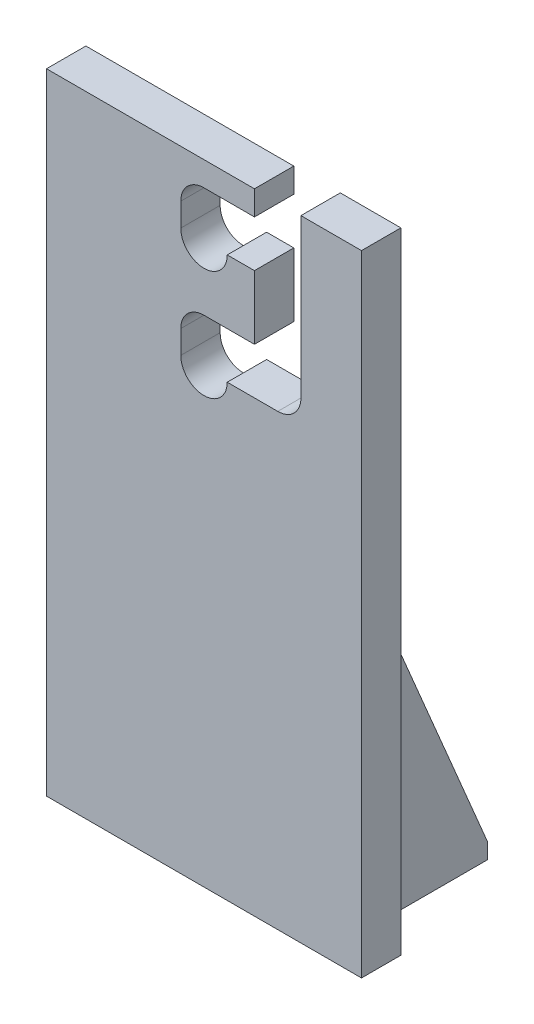
ISO-10303-21;
HEADER;
FILE_DESCRIPTION(('STEP AP214'),'2;1');
FILE_NAME('part.step','',(''),(''),'','','');
FILE_SCHEMA(('AUTOMOTIVE_DESIGN { 1 0 10303 214 1 1 1 1 }'));
ENDSEC;
DATA;
#1=APPLICATION_CONTEXT('core data for automotive mechanical design processes');
#2=APPLICATION_PROTOCOL_DEFINITION('international standard','automotive_design',2000,#1);
#3=PRODUCT_CONTEXT('',#1,'mechanical');
#4=PRODUCT('Part','Part','',(#3));
#5=PRODUCT_RELATED_PRODUCT_CATEGORY('part','',(#4));
#6=PRODUCT_DEFINITION_FORMATION('','',#4);
#7=PRODUCT_DEFINITION_CONTEXT('part definition',#1,'design');
#8=PRODUCT_DEFINITION('design','',#6,#7);
#9=PRODUCT_DEFINITION_SHAPE('','',#8);
#10=(LENGTH_UNIT() NAMED_UNIT(*) SI_UNIT(.MILLI.,.METRE.));
#11=(NAMED_UNIT(*) PLANE_ANGLE_UNIT() SI_UNIT($,.RADIAN.));
#12=(NAMED_UNIT(*) SI_UNIT($,.STERADIAN.) SOLID_ANGLE_UNIT());
#13=UNCERTAINTY_MEASURE_WITH_UNIT(LENGTH_MEASURE(1.E-05),#10,'distance_accuracy_value','');
#14=(GEOMETRIC_REPRESENTATION_CONTEXT(3) GLOBAL_UNCERTAINTY_ASSIGNED_CONTEXT((#13)) GLOBAL_UNIT_ASSIGNED_CONTEXT((#10,
#11,#12)) REPRESENTATION_CONTEXT('',''));
#15=CARTESIAN_POINT('',(0.,0.,0.));
#16=DIRECTION('',(0.,0.,1.));
#17=DIRECTION('',(1.,0.,0.));
#18=AXIS2_PLACEMENT_3D('',#15,#16,#17);
#19=CARTESIAN_POINT('',(0.,0.,2.5));
#20=DIRECTION('',(0.,0.,1.));
#21=DIRECTION('',(1.,0.,0.));
#22=AXIS2_PLACEMENT_3D('',#19,#20,#21);
#23=PLANE('',#22);
#24=CARTESIAN_POINT('',(10.,35.5,2.5));
#25=DIRECTION('',(0.,0.,-1.));
#26=DIRECTION('',(-1.,0.,0.));
#27=AXIS2_PLACEMENT_3D('',#24,#25,#26);
#28=CIRCLE('',#27,1.475);
#29=CARTESIAN_POINT('',(11.475,35.5,2.5));
#30=VERTEX_POINT('',#29);
#31=CARTESIAN_POINT('',(8.525,35.5,2.5));
#32=VERTEX_POINT('',#31);
#33=EDGE_CURVE('E230',#30,#32,#28,.T.);
#34=ORIENTED_EDGE('',*,*,#33,.T.);
#35=DIRECTION('',(0.,1.,0.));
#36=VECTOR('',#35,1.);
#37=CARTESIAN_POINT('',(8.525,35.5,2.5));
#38=LINE('',#37,#36);
#39=CARTESIAN_POINT('',(8.525,36.98,2.5));
#40=VERTEX_POINT('',#39);
#41=EDGE_CURVE('E274',#32,#40,#38,.T.);
#42=ORIENTED_EDGE('',*,*,#41,.T.);
#43=CARTESIAN_POINT('',(9.995,36.98,2.5));
#44=DIRECTION('',(0.,0.,1.));
#45=DIRECTION('',(1.,0.,0.));
#46=AXIS2_PLACEMENT_3D('',#43,#44,#45);
#47=CIRCLE('',#46,1.47);
#48=CARTESIAN_POINT('',(9.995,38.45,2.5));
#49=VERTEX_POINT('',#48);
#50=EDGE_CURVE('E332',#40,#49,#47,.F.);
#51=ORIENTED_EDGE('',*,*,#50,.T.);
#52=DIRECTION('',(1.,0.,0.));
#53=VECTOR('',#52,1.);
#54=CARTESIAN_POINT('',(9.995,38.45,2.5));
#55=LINE('',#54,#53);
#56=CARTESIAN_POINT('',(13.2029216991025,38.45,2.5));
#57=VERTEX_POINT('',#56);
#58=EDGE_CURVE('E268',#49,#57,#55,.T.);
#59=ORIENTED_EDGE('',*,*,#58,.T.);
#60=DIRECTION('',(0.,1.,0.));
#61=VECTOR('',#60,1.);
#62=CARTESIAN_POINT('',(13.2029216991025,38.45,2.5));
#63=LINE('',#62,#61);
#64=CARTESIAN_POINT('',(13.2029216991025,40.,2.5));
#65=VERTEX_POINT('',#64);
#66=EDGE_CURVE('E68',#57,#65,#63,.T.);
#67=ORIENTED_EDGE('',*,*,#66,.T.);
#68=DIRECTION('',(-1.,0.,0.));
#69=VECTOR('',#68,1.);
#70=CARTESIAN_POINT('',(12.8029216991025,40.,2.5));
#71=LINE('',#70,#69);
#72=CARTESIAN_POINT('',(0.,40.,2.5));
#73=VERTEX_POINT('',#72);
#74=EDGE_CURVE('E11',#65,#73,#71,.T.);
#75=ORIENTED_EDGE('',*,*,#74,.T.);
#76=DIRECTION('',(0.,-1.,0.));
#77=VECTOR('',#76,1.);
#78=CARTESIAN_POINT('',(0.,0.,2.5));
#79=LINE('',#78,#77);
#80=CARTESIAN_POINT('',(0.,0.,2.5));
#81=VERTEX_POINT('',#80);
#82=EDGE_CURVE('E49',#73,#81,#79,.T.);
#83=ORIENTED_EDGE('',*,*,#82,.T.);
#84=DIRECTION('',(1.,0.,0.));
#85=VECTOR('',#84,1.);
#86=CARTESIAN_POINT('',(0.,0.,2.5));
#87=LINE('',#86,#85);
#88=CARTESIAN_POINT('',(20.,0.,2.5));
#89=VERTEX_POINT('',#88);
#90=EDGE_CURVE('E244',#81,#89,#87,.T.);
#91=ORIENTED_EDGE('',*,*,#90,.T.);
#92=DIRECTION('',(0.,1.,0.));
#93=VECTOR('',#92,1.);
#94=CARTESIAN_POINT('',(20.,0.,2.5));
#95=LINE('',#94,#93);
#96=CARTESIAN_POINT('',(20.,40.,2.5));
#97=VERTEX_POINT('',#96);
#98=EDGE_CURVE('E233',#89,#97,#95,.T.);
#99=ORIENTED_EDGE('',*,*,#98,.T.);
#100=CARTESIAN_POINT('',(16.1529216991025,40.,2.5));
#101=VERTEX_POINT('',#100);
#102=EDGE_CURVE('E55',#97,#101,#71,.T.);
#103=ORIENTED_EDGE('',*,*,#102,.T.);
#104=DIRECTION('',(0.,1.,0.));
#105=VECTOR('',#104,1.);
#106=CARTESIAN_POINT('',(16.1529216991025,29.97,2.5));
#107=LINE('',#106,#105);
#108=CARTESIAN_POINT('',(16.1529216991025,29.97,2.5));
#109=VERTEX_POINT('',#108);
#110=EDGE_CURVE('E328',#109,#101,#107,.T.);
#111=ORIENTED_EDGE('',*,*,#110,.F.);
#112=CARTESIAN_POINT('',(14.6829216991025,29.97,2.5));
#113=DIRECTION('',(0.,0.,1.));
#114=DIRECTION('',(1.,0.,0.));
#115=AXIS2_PLACEMENT_3D('',#112,#113,#114);
#116=CIRCLE('',#115,1.47);
#117=CARTESIAN_POINT('',(14.6829216991025,28.5,2.5));
#118=VERTEX_POINT('',#117);
#119=EDGE_CURVE('E361',#118,#109,#116,.T.);
#120=ORIENTED_EDGE('',*,*,#119,.F.);
#121=DIRECTION('',(1.,0.,0.));
#122=VECTOR('',#121,1.);
#123=CARTESIAN_POINT('',(11.475,28.5,2.5));
#124=LINE('',#123,#122);
#125=CARTESIAN_POINT('',(11.475,28.5,2.5));
#126=VERTEX_POINT('',#125);
#127=EDGE_CURVE('E346',#126,#118,#124,.T.);
#128=ORIENTED_EDGE('',*,*,#127,.F.);
#129=CARTESIAN_POINT('',(10.,28.5,2.5));
#130=DIRECTION('',(0.,0.,-1.));
#131=DIRECTION('',(-1.,0.,0.));
#132=AXIS2_PLACEMENT_3D('',#129,#130,#131);
#133=CIRCLE('',#132,1.475);
#134=CARTESIAN_POINT('',(8.52499999999949,28.5,2.5));
#135=VERTEX_POINT('',#134);
#136=EDGE_CURVE('E259',#126,#135,#133,.T.);
#137=ORIENTED_EDGE('',*,*,#136,.T.);
#138=DIRECTION('',(3.46944695195255E-13,1.,0.));
#139=VECTOR('',#138,1.);
#140=CARTESIAN_POINT('',(8.525,29.97,2.5));
#141=LINE('',#140,#139);
#142=CARTESIAN_POINT('',(8.525,29.975,2.5));
#143=VERTEX_POINT('',#142);
#144=EDGE_CURVE('E302',#135,#143,#141,.T.);
#145=ORIENTED_EDGE('',*,*,#144,.T.);
#146=CARTESIAN_POINT('',(9.995,29.975,2.5));
#147=DIRECTION('',(0.,0.,1.));
#148=DIRECTION('',(1.,0.,0.));
#149=AXIS2_PLACEMENT_3D('',#146,#147,#148);
#150=CIRCLE('',#149,1.47);
#151=CARTESIAN_POINT('',(9.995,31.445,2.5));
#152=VERTEX_POINT('',#151);
#153=EDGE_CURVE('E352',#143,#152,#150,.F.);
#154=ORIENTED_EDGE('',*,*,#153,.T.);
#155=DIRECTION('',(1.,0.,0.));
#156=VECTOR('',#155,1.);
#157=CARTESIAN_POINT('',(9.995,31.445,2.5));
#158=LINE('',#157,#156);
#159=CARTESIAN_POINT('',(13.2029216991025,31.445,2.5));
#160=VERTEX_POINT('',#159);
#161=EDGE_CURVE('E347',#152,#160,#158,.T.);
#162=ORIENTED_EDGE('',*,*,#161,.T.);
#163=DIRECTION('',(0.,-1.,0.));
#164=VECTOR('',#163,1.);
#165=CARTESIAN_POINT('',(13.2029216991025,35.5,2.5));
#166=LINE('',#165,#164);
#167=CARTESIAN_POINT('',(13.2029216991025,35.5,2.5));
#168=VERTEX_POINT('',#167);
#169=EDGE_CURVE('E342',#168,#160,#166,.T.);
#170=ORIENTED_EDGE('',*,*,#169,.F.);
#171=DIRECTION('',(1.,0.,0.));
#172=VECTOR('',#171,1.);
#173=CARTESIAN_POINT('',(11.475,35.5,2.5));
#174=LINE('',#173,#172);
#175=EDGE_CURVE('E262',#30,#168,#174,.T.);
#176=ORIENTED_EDGE('',*,*,#175,.F.);
#177=EDGE_LOOP('',(#34,#42,#51,#59,#67,#75,#83,#91,#99,#103,#111,#120,#128,#137,#145,#154,#162,
#170,#176));
#178=FACE_BOUND('',#177,.T.);
#179=ADVANCED_FACE('F45',(#178),#23,.T.);
#180=CARTESIAN_POINT('',(5.,1.,-8.));
#181=DIRECTION('',(0.,0.388057000058133,-0.921635375138065));
#182=DIRECTION('',(0.,0.921635375138065,0.388057000058133));
#183=AXIS2_PLACEMENT_3D('',#180,#181,#182);
#184=PLANE('',#183);
#185=DIRECTION('',(0.,0.921635375138065,0.388057000058133));
#186=VECTOR('',#185,1.);
#187=CARTESIAN_POINT('',(2.5,1.,-8.));
#188=LINE('',#187,#186);
#189=CARTESIAN_POINT('',(2.5,1.,-8.));
#190=VERTEX_POINT('',#189);
#191=CARTESIAN_POINT('',(2.5,20.,0.));
#192=VERTEX_POINT('',#191);
#193=EDGE_CURVE('E433',#190,#192,#188,.T.);
#194=ORIENTED_EDGE('',*,*,#193,.T.);
#195=DIRECTION('',(1.,0.,0.));
#196=VECTOR('',#195,1.);
#197=CARTESIAN_POINT('',(0.,20.,0.));
#198=LINE('',#197,#196);
#199=CARTESIAN_POINT('',(7.5,20.,0.));
#200=VERTEX_POINT('',#199);
#201=EDGE_CURVE('E448',#192,#200,#198,.T.);
#202=ORIENTED_EDGE('',*,*,#201,.T.);
#203=DIRECTION('',(0.,0.921635375138065,0.388057000058133));
#204=VECTOR('',#203,1.);
#205=CARTESIAN_POINT('',(7.5,1.,-8.));
#206=LINE('',#205,#204);
#207=CARTESIAN_POINT('',(7.5,1.,-8.));
#208=VERTEX_POINT('',#207);
#209=EDGE_CURVE('E444',#208,#200,#206,.T.);
#210=ORIENTED_EDGE('',*,*,#209,.F.);
#211=DIRECTION('',(1.,0.,0.));
#212=VECTOR('',#211,1.);
#213=CARTESIAN_POINT('',(2.5,1.,-8.));
#214=LINE('',#213,#212);
#215=EDGE_CURVE('E456',#190,#208,#214,.T.);
#216=ORIENTED_EDGE('',*,*,#215,.F.);
#217=EDGE_LOOP('',(#194,#202,#210,#216));
#218=FACE_BOUND('',#217,.T.);
#219=ADVANCED_FACE('F589',(#218),#184,.T.);
#220=CARTESIAN_POINT('',(15.,1.,-8.));
#221=DIRECTION('',(0.,-0.388057000058133,0.921635375138065));
#222=DIRECTION('',(0.,0.921635375138065,0.388057000058133));
#223=AXIS2_PLACEMENT_3D('',#220,#221,#222);
#224=PLANE('',#223);
#225=DIRECTION('',(0.,0.921635375138065,0.388057000058133));
#226=VECTOR('',#225,1.);
#227=CARTESIAN_POINT('',(12.5,1.,-8.));
#228=LINE('',#227,#226);
#229=CARTESIAN_POINT('',(12.5,1.,-8.));
#230=VERTEX_POINT('',#229);
#231=CARTESIAN_POINT('',(12.5,20.,0.));
#232=VERTEX_POINT('',#231);
#233=EDGE_CURVE('E402',#230,#232,#228,.T.);
#234=ORIENTED_EDGE('',*,*,#233,.T.);
#235=DIRECTION('',(-1.,0.,0.));
#236=VECTOR('',#235,1.);
#237=CARTESIAN_POINT('',(0.,20.,0.));
#238=LINE('',#237,#236);
#239=CARTESIAN_POINT('',(17.5,20.,0.));
#240=VERTEX_POINT('',#239);
#241=EDGE_CURVE('E406',#232,#240,#238,.F.);
#242=ORIENTED_EDGE('',*,*,#241,.T.);
#243=DIRECTION('',(0.,0.921635375138065,0.388057000058133));
#244=VECTOR('',#243,1.);
#245=CARTESIAN_POINT('',(17.5,1.,-8.));
#246=LINE('',#245,#244);
#247=CARTESIAN_POINT('',(17.5,1.,-8.));
#248=VERTEX_POINT('',#247);
#249=EDGE_CURVE('E401',#248,#240,#246,.T.);
#250=ORIENTED_EDGE('',*,*,#249,.F.);
#251=DIRECTION('',(-1.,0.,0.));
#252=VECTOR('',#251,1.);
#253=CARTESIAN_POINT('',(17.5,1.,-8.));
#254=LINE('',#253,#252);
#255=EDGE_CURVE('E414',#248,#230,#254,.T.);
#256=ORIENTED_EDGE('',*,*,#255,.T.);
#257=EDGE_LOOP('',(#234,#242,#250,#256));
#258=FACE_BOUND('',#257,.T.);
#259=ADVANCED_FACE('F592',(#258),#224,.F.);
#260=CARTESIAN_POINT('',(17.5,1.,0.));
#261=DIRECTION('',(-1.,0.,0.));
#262=DIRECTION('',(0.,0.,1.));
#263=AXIS2_PLACEMENT_3D('',#260,#261,#262);
#264=PLANE('',#263);
#265=DIRECTION('',(0.,0.,-1.));
#266=VECTOR('',#265,1.);
#267=CARTESIAN_POINT('',(17.5,0.,0.));
#268=LINE('',#267,#266);
#269=CARTESIAN_POINT('',(17.5,0.,0.));
#270=VERTEX_POINT('',#269);
#271=CARTESIAN_POINT('',(17.5,0.,-8.));
#272=VERTEX_POINT('',#271);
#273=EDGE_CURVE('E413',#270,#272,#268,.T.);
#274=ORIENTED_EDGE('',*,*,#273,.T.);
#275=DIRECTION('',(0.,-1.,0.));
#276=VECTOR('',#275,1.);
#277=CARTESIAN_POINT('',(17.5,1.,-8.));
#278=LINE('',#277,#276);
#279=EDGE_CURVE('E428',#248,#272,#278,.T.);
#280=ORIENTED_EDGE('',*,*,#279,.F.);
#281=ORIENTED_EDGE('',*,*,#249,.T.);
#282=DIRECTION('',(0.,-1.,0.));
#283=VECTOR('',#282,1.);
#284=CARTESIAN_POINT('',(17.5,1.,0.));
#285=LINE('',#284,#283);
#286=EDGE_CURVE('E419',#240,#270,#285,.T.);
#287=ORIENTED_EDGE('',*,*,#286,.T.);
#288=EDGE_LOOP('',(#274,#280,#281,#287));
#289=FACE_BOUND('',#288,.T.);
#290=ADVANCED_FACE('F598',(#289),#264,.F.);
#291=CARTESIAN_POINT('',(17.5,1.,-8.));
#292=DIRECTION('',(0.,0.,1.));
#293=DIRECTION('',(1.,0.,0.));
#294=AXIS2_PLACEMENT_3D('',#291,#292,#293);
#295=PLANE('',#294);
#296=DIRECTION('',(-1.,0.,0.));
#297=VECTOR('',#296,1.);
#298=CARTESIAN_POINT('',(17.5,0.,-8.));
#299=LINE('',#298,#297);
#300=CARTESIAN_POINT('',(12.5,0.,-8.));
#301=VERTEX_POINT('',#300);
#302=EDGE_CURVE('E418',#272,#301,#299,.T.);
#303=ORIENTED_EDGE('',*,*,#302,.T.);
#304=DIRECTION('',(0.,-1.,0.));
#305=VECTOR('',#304,1.);
#306=CARTESIAN_POINT('',(12.5,1.,-8.));
#307=LINE('',#306,#305);
#308=EDGE_CURVE('E432',#230,#301,#307,.T.);
#309=ORIENTED_EDGE('',*,*,#308,.F.);
#310=ORIENTED_EDGE('',*,*,#255,.F.);
#311=ORIENTED_EDGE('',*,*,#279,.T.);
#312=EDGE_LOOP('',(#303,#309,#310,#311));
#313=FACE_BOUND('',#312,.T.);
#314=ADVANCED_FACE('F607',(#313),#295,.F.);
#315=CARTESIAN_POINT('',(12.5,1.,0.));
#316=DIRECTION('',(1.,0.,0.));
#317=DIRECTION('',(0.,0.,-1.));
#318=AXIS2_PLACEMENT_3D('',#315,#316,#317);
#319=PLANE('',#318);
#320=DIRECTION('',(0.,-1.,0.));
#321=VECTOR('',#320,1.);
#322=CARTESIAN_POINT('',(12.5,1.,0.));
#323=LINE('',#322,#321);
#324=CARTESIAN_POINT('',(12.5,0.,0.));
#325=VERTEX_POINT('',#324);
#326=EDGE_CURVE('E437',#232,#325,#323,.T.);
#327=ORIENTED_EDGE('',*,*,#326,.F.);
#328=ORIENTED_EDGE('',*,*,#233,.F.);
#329=ORIENTED_EDGE('',*,*,#308,.T.);
#330=DIRECTION('',(0.,0.,1.));
#331=VECTOR('',#330,1.);
#332=CARTESIAN_POINT('',(12.5,0.,0.));
#333=LINE('',#332,#331);
#334=EDGE_CURVE('E423',#301,#325,#333,.T.);
#335=ORIENTED_EDGE('',*,*,#334,.T.);
#336=EDGE_LOOP('',(#327,#328,#329,#335));
#337=FACE_BOUND('',#336,.T.);
#338=ADVANCED_FACE('F609',(#337),#319,.F.);
#339=CARTESIAN_POINT('',(7.5,1.,0.));
#340=DIRECTION('',(1.,0.,0.));
#341=DIRECTION('',(0.,0.,-1.));
#342=AXIS2_PLACEMENT_3D('',#339,#340,#341);
#343=PLANE('',#342);
#344=ORIENTED_EDGE('',*,*,#209,.T.);
#345=DIRECTION('',(0.,-1.,0.));
#346=VECTOR('',#345,1.);
#347=CARTESIAN_POINT('',(7.5,1.,0.));
#348=LINE('',#347,#346);
#349=CARTESIAN_POINT('',(7.5,0.,0.));
#350=VERTEX_POINT('',#349);
#351=EDGE_CURVE('E476',#200,#350,#348,.T.);
#352=ORIENTED_EDGE('',*,*,#351,.T.);
#353=DIRECTION('',(0.,0.,1.));
#354=VECTOR('',#353,1.);
#355=CARTESIAN_POINT('',(7.5,0.,0.));
#356=LINE('',#355,#354);
#357=CARTESIAN_POINT('',(7.5,0.,-8.));
#358=VERTEX_POINT('',#357);
#359=EDGE_CURVE('E460',#358,#350,#356,.T.);
#360=ORIENTED_EDGE('',*,*,#359,.F.);
#361=DIRECTION('',(0.,-1.,0.));
#362=VECTOR('',#361,1.);
#363=CARTESIAN_POINT('',(7.5,1.,-8.));
#364=LINE('',#363,#362);
#365=EDGE_CURVE('E480',#208,#358,#364,.T.);
#366=ORIENTED_EDGE('',*,*,#365,.F.);
#367=EDGE_LOOP('',(#344,#352,#360,#366));
#368=FACE_BOUND('',#367,.T.);
#369=ADVANCED_FACE('F603',(#368),#343,.T.);
#370=CARTESIAN_POINT('',(2.5,1.,-8.));
#371=DIRECTION('',(0.,0.,-1.));
#372=DIRECTION('',(-1.,0.,0.));
#373=AXIS2_PLACEMENT_3D('',#370,#371,#372);
#374=PLANE('',#373);
#375=DIRECTION('',(1.,0.,0.));
#376=VECTOR('',#375,1.);
#377=CARTESIAN_POINT('',(2.5,0.,-8.));
#378=LINE('',#377,#376);
#379=CARTESIAN_POINT('',(2.5,0.,-8.));
#380=VERTEX_POINT('',#379);
#381=EDGE_CURVE('E465',#380,#358,#378,.T.);
#382=ORIENTED_EDGE('',*,*,#381,.F.);
#383=DIRECTION('',(0.,-1.,0.));
#384=VECTOR('',#383,1.);
#385=CARTESIAN_POINT('',(2.5,1.,-8.));
#386=LINE('',#385,#384);
#387=EDGE_CURVE('E461',#190,#380,#386,.T.);
#388=ORIENTED_EDGE('',*,*,#387,.F.);
#389=ORIENTED_EDGE('',*,*,#215,.T.);
#390=ORIENTED_EDGE('',*,*,#365,.T.);
#391=EDGE_LOOP('',(#382,#388,#389,#390));
#392=FACE_BOUND('',#391,.T.);
#393=ADVANCED_FACE('F633',(#392),#374,.T.);
#394=CARTESIAN_POINT('',(2.5,1.,0.));
#395=DIRECTION('',(-1.,0.,0.));
#396=DIRECTION('',(0.,0.,1.));
#397=AXIS2_PLACEMENT_3D('',#394,#395,#396);
#398=PLANE('',#397);
#399=DIRECTION('',(0.,0.,-1.));
#400=VECTOR('',#399,1.);
#401=CARTESIAN_POINT('',(2.5,0.,0.));
#402=LINE('',#401,#400);
#403=CARTESIAN_POINT('',(2.5,0.,0.));
#404=VERTEX_POINT('',#403);
#405=EDGE_CURVE('E455',#404,#380,#402,.T.);
#406=ORIENTED_EDGE('',*,*,#405,.F.);
#407=DIRECTION('',(0.,-1.,0.));
#408=VECTOR('',#407,1.);
#409=CARTESIAN_POINT('',(2.5,1.,0.));
#410=LINE('',#409,#408);
#411=EDGE_CURVE('E472',#192,#404,#410,.T.);
#412=ORIENTED_EDGE('',*,*,#411,.F.);
#413=ORIENTED_EDGE('',*,*,#193,.F.);
#414=ORIENTED_EDGE('',*,*,#387,.T.);
#415=EDGE_LOOP('',(#406,#412,#413,#414));
#416=FACE_BOUND('',#415,.T.);
#417=ADVANCED_FACE('F635',(#416),#398,.T.);
#418=CARTESIAN_POINT('',(0.,0.,6.));
#419=DIRECTION('',(0.,1.,0.));
#420=DIRECTION('',(0.,0.,1.));
#421=AXIS2_PLACEMENT_3D('',#418,#419,#420);
#422=PLANE('',#421);
#423=ORIENTED_EDGE('',*,*,#90,.F.);
#424=DIRECTION('',(0.,0.,-1.));
#425=VECTOR('',#424,1.);
#426=CARTESIAN_POINT('',(0.,0.,6.));
#427=LINE('',#426,#425);
#428=CARTESIAN_POINT('',(0.,0.,0.));
#429=VERTEX_POINT('',#428);
#430=EDGE_CURVE('E249',#81,#429,#427,.T.);
#431=ORIENTED_EDGE('',*,*,#430,.T.);
#432=DIRECTION('',(1.,0.,0.));
#433=VECTOR('',#432,1.);
#434=CARTESIAN_POINT('',(0.,0.,0.));
#435=LINE('',#434,#433);
#436=EDGE_CURVE('E489',#429,#404,#435,.T.);
#437=ORIENTED_EDGE('',*,*,#436,.T.);
#438=ORIENTED_EDGE('',*,*,#405,.T.);
#439=ORIENTED_EDGE('',*,*,#381,.T.);
#440=ORIENTED_EDGE('',*,*,#359,.T.);
#441=EDGE_CURVE('E493',#350,#325,#435,.T.);
#442=ORIENTED_EDGE('',*,*,#441,.T.);
#443=ORIENTED_EDGE('',*,*,#334,.F.);
#444=ORIENTED_EDGE('',*,*,#302,.F.);
#445=ORIENTED_EDGE('',*,*,#273,.F.);
#446=CARTESIAN_POINT('',(20.,0.,0.));
#447=VERTEX_POINT('',#446);
#448=EDGE_CURVE('E488',#270,#447,#435,.T.);
#449=ORIENTED_EDGE('',*,*,#448,.T.);
#450=DIRECTION('',(0.,0.,-1.));
#451=VECTOR('',#450,1.);
#452=CARTESIAN_POINT('',(20.,0.,6.));
#453=LINE('',#452,#451);
#454=EDGE_CURVE('E239',#89,#447,#453,.T.);
#455=ORIENTED_EDGE('',*,*,#454,.F.);
#456=EDGE_LOOP('',(#423,#431,#437,#438,#439,#440,#442,#443,#444,#445,#449,#455));
#457=FACE_BOUND('',#456,.T.);
#458=ADVANCED_FACE('F515',(#457),#422,.F.);
#459=CARTESIAN_POINT('',(0.,0.,6.));
#460=DIRECTION('',(1.,0.,0.));
#461=DIRECTION('',(0.,0.,-1.));
#462=AXIS2_PLACEMENT_3D('',#459,#460,#461);
#463=PLANE('',#462);
#464=ORIENTED_EDGE('',*,*,#82,.F.);
#465=DIRECTION('',(0.,0.,-1.));
#466=VECTOR('',#465,1.);
#467=CARTESIAN_POINT('',(0.,40.,6.));
#468=LINE('',#467,#466);
#469=CARTESIAN_POINT('',(0.,40.,0.));
#470=VERTEX_POINT('',#469);
#471=EDGE_CURVE('E238',#73,#470,#468,.T.);
#472=ORIENTED_EDGE('',*,*,#471,.T.);
#473=DIRECTION('',(0.,-1.,0.));
#474=VECTOR('',#473,1.);
#475=CARTESIAN_POINT('',(0.,0.,0.));
#476=LINE('',#475,#474);
#477=EDGE_CURVE('E477',#470,#429,#476,.T.);
#478=ORIENTED_EDGE('',*,*,#477,.T.);
#479=ORIENTED_EDGE('',*,*,#430,.F.);
#480=EDGE_LOOP('',(#464,#472,#478,#479));
#481=FACE_BOUND('',#480,.T.);
#482=ADVANCED_FACE('F512',(#481),#463,.F.);
#483=CARTESIAN_POINT('',(9.995,36.98,17.551106751586));
#484=DIRECTION('',(0.,0.,-1.));
#485=DIRECTION('',(-1.,0.,0.));
#486=AXIS2_PLACEMENT_3D('',#483,#484,#485);
#487=CYLINDRICAL_SURFACE('',#486,1.47);
#488=DIRECTION('',(0.,0.,-1.));
#489=VECTOR('',#488,1.);
#490=CARTESIAN_POINT('',(8.525,36.98,17.551106751586));
#491=LINE('',#490,#489);
#492=CARTESIAN_POINT('',(8.525,36.98,0.));
#493=VERTEX_POINT('',#492);
#494=EDGE_CURVE('E335',#40,#493,#491,.T.);
#495=ORIENTED_EDGE('',*,*,#494,.T.);
#496=CARTESIAN_POINT('',(9.995,36.98,0.));
#497=DIRECTION('',(0.,0.,-1.));
#498=DIRECTION('',(-1.,0.,0.));
#499=AXIS2_PLACEMENT_3D('',#496,#497,#498);
#500=CIRCLE('',#499,1.47);
#501=CARTESIAN_POINT('',(9.995,38.45,0.));
#502=VERTEX_POINT('',#501);
#503=EDGE_CURVE('E324',#493,#502,#500,.T.);
#504=ORIENTED_EDGE('',*,*,#503,.T.);
#505=DIRECTION('',(0.,0.,-1.));
#506=VECTOR('',#505,1.);
#507=CARTESIAN_POINT('',(9.995,38.45,17.551106751586));
#508=LINE('',#507,#506);
#509=EDGE_CURVE('E336',#49,#502,#508,.T.);
#510=ORIENTED_EDGE('',*,*,#509,.F.);
#511=ORIENTED_EDGE('',*,*,#50,.F.);
#512=EDGE_LOOP('',(#495,#504,#510,#511));
#513=FACE_BOUND('',#512,.T.);
#514=ADVANCED_FACE('F574',(#513),#487,.F.);
#515=CARTESIAN_POINT('',(0.,40.,6.));
#516=DIRECTION('',(0.,-1.,0.));
#517=DIRECTION('',(0.,0.,-1.));
#518=AXIS2_PLACEMENT_3D('',#515,#516,#517);
#519=PLANE('',#518);
#520=ORIENTED_EDGE('',*,*,#471,.F.);
#521=ORIENTED_EDGE('',*,*,#74,.F.);
#522=DIRECTION('',(0.,0.,-1.));
#523=VECTOR('',#522,1.);
#524=CARTESIAN_POINT('',(13.2029216991025,40.,17.551106751586));
#525=LINE('',#524,#523);
#526=CARTESIAN_POINT('',(13.2029216991025,40.,0.));
#527=VERTEX_POINT('',#526);
#528=EDGE_CURVE('E369',#65,#527,#525,.T.);
#529=ORIENTED_EDGE('',*,*,#528,.T.);
#530=DIRECTION('',(-1.,0.,0.));
#531=VECTOR('',#530,1.);
#532=CARTESIAN_POINT('',(0.,40.,0.));
#533=LINE('',#532,#531);
#534=EDGE_CURVE('E496',#527,#470,#533,.T.);
#535=ORIENTED_EDGE('',*,*,#534,.T.);
#536=EDGE_LOOP('',(#520,#521,#529,#535));
#537=FACE_BOUND('',#536,.T.);
#538=ADVANCED_FACE('F504',(#537),#519,.F.);
#539=CARTESIAN_POINT('',(14.6829216991025,29.97,17.551106751586));
#540=DIRECTION('',(0.,0.,-1.));
#541=DIRECTION('',(-1.,0.,0.));
#542=AXIS2_PLACEMENT_3D('',#539,#540,#541);
#543=CYLINDRICAL_SURFACE('',#542,1.47);
#544=ORIENTED_EDGE('',*,*,#119,.T.);
#545=DIRECTION('',(0.,0.,-1.));
#546=VECTOR('',#545,1.);
#547=CARTESIAN_POINT('',(16.1529216991025,29.97,17.551106751586));
#548=LINE('',#547,#546);
#549=CARTESIAN_POINT('',(16.1529216991025,29.97,0.));
#550=VERTEX_POINT('',#549);
#551=EDGE_CURVE('E317',#109,#550,#548,.T.);
#552=ORIENTED_EDGE('',*,*,#551,.T.);
#553=CARTESIAN_POINT('',(14.6829216991025,29.97,0.));
#554=DIRECTION('',(0.,0.,1.));
#555=DIRECTION('',(1.,0.,0.));
#556=AXIS2_PLACEMENT_3D('',#553,#554,#555);
#557=CIRCLE('',#556,1.47);
#558=CARTESIAN_POINT('',(14.6829216991025,28.5,0.));
#559=VERTEX_POINT('',#558);
#560=EDGE_CURVE('E308',#559,#550,#557,.T.);
#561=ORIENTED_EDGE('',*,*,#560,.F.);
#562=DIRECTION('',(0.,0.,-1.));
#563=VECTOR('',#562,1.);
#564=CARTESIAN_POINT('',(14.6829216991025,28.5,17.551106751586));
#565=LINE('',#564,#563);
#566=EDGE_CURVE('E312',#118,#559,#565,.T.);
#567=ORIENTED_EDGE('',*,*,#566,.F.);
#568=EDGE_LOOP('',(#544,#552,#561,#567));
#569=FACE_BOUND('',#568,.T.);
#570=ADVANCED_FACE('F526',(#569),#543,.F.);
#571=CARTESIAN_POINT('',(16.1529216991025,29.97,17.551106751586));
#572=DIRECTION('',(-1.,0.,0.));
#573=DIRECTION('',(0.,0.,1.));
#574=AXIS2_PLACEMENT_3D('',#571,#572,#573);
#575=PLANE('',#574);
#576=ORIENTED_EDGE('',*,*,#110,.T.);
#577=DIRECTION('',(0.,0.,-1.));
#578=VECTOR('',#577,1.);
#579=CARTESIAN_POINT('',(16.1529216991025,40.,17.551106751586));
#580=LINE('',#579,#578);
#581=CARTESIAN_POINT('',(16.1529216991025,40.,0.));
#582=VERTEX_POINT('',#581);
#583=EDGE_CURVE('E228',#101,#582,#580,.T.);
#584=ORIENTED_EDGE('',*,*,#583,.T.);
#585=DIRECTION('',(0.,1.,0.));
#586=VECTOR('',#585,1.);
#587=CARTESIAN_POINT('',(16.1529216991025,29.97,0.));
#588=LINE('',#587,#586);
#589=EDGE_CURVE('E313',#550,#582,#588,.T.);
#590=ORIENTED_EDGE('',*,*,#589,.F.);
#591=ORIENTED_EDGE('',*,*,#551,.F.);
#592=EDGE_LOOP('',(#576,#584,#590,#591));
#593=FACE_BOUND('',#592,.T.);
#594=ADVANCED_FACE('F523',(#593),#575,.T.);
#595=CARTESIAN_POINT('',(11.475,28.5,17.551106751586));
#596=DIRECTION('',(0.,1.,0.));
#597=DIRECTION('',(0.,0.,1.));
#598=AXIS2_PLACEMENT_3D('',#595,#596,#597);
#599=PLANE('',#598);
#600=ORIENTED_EDGE('',*,*,#127,.T.);
#601=ORIENTED_EDGE('',*,*,#566,.T.);
#602=DIRECTION('',(1.,0.,0.));
#603=VECTOR('',#602,1.);
#604=CARTESIAN_POINT('',(11.475,28.5,0.));
#605=LINE('',#604,#603);
#606=CARTESIAN_POINT('',(11.475,28.5,0.));
#607=VERTEX_POINT('',#606);
#608=EDGE_CURVE('E303',#607,#559,#605,.T.);
#609=ORIENTED_EDGE('',*,*,#608,.F.);
#610=DIRECTION('',(0.,0.,-1.));
#611=VECTOR('',#610,1.);
#612=CARTESIAN_POINT('',(11.475,28.5,17.551106751586));
#613=LINE('',#612,#611);
#614=EDGE_CURVE('E307',#126,#607,#613,.T.);
#615=ORIENTED_EDGE('',*,*,#614,.F.);
#616=EDGE_LOOP('',(#600,#601,#609,#615));
#617=FACE_BOUND('',#616,.T.);
#618=ADVANCED_FACE('F529',(#617),#599,.T.);
#619=CARTESIAN_POINT('',(10.,28.5,17.551106751586));
#620=DIRECTION('',(0.,0.,-1.));
#621=DIRECTION('',(-1.,0.,0.));
#622=AXIS2_PLACEMENT_3D('',#619,#620,#621);
#623=CYLINDRICAL_SURFACE('',#622,1.475);
#624=DIRECTION('',(0.,0.,-1.));
#625=VECTOR('',#624,1.);
#626=CARTESIAN_POINT('',(8.525,28.5,17.551106751586));
#627=LINE('',#626,#625);
#628=CARTESIAN_POINT('',(8.525,28.5,0.));
#629=VERTEX_POINT('',#628);
#630=EDGE_CURVE('E301',#135,#629,#627,.T.);
#631=ORIENTED_EDGE('',*,*,#630,.F.);
#632=ORIENTED_EDGE('',*,*,#136,.F.);
#633=ORIENTED_EDGE('',*,*,#614,.T.);
#634=CARTESIAN_POINT('',(10.,28.5,0.));
#635=DIRECTION('',(0.,0.,1.));
#636=DIRECTION('',(1.,0.,0.));
#637=AXIS2_PLACEMENT_3D('',#634,#635,#636);
#638=CIRCLE('',#637,1.475);
#639=EDGE_CURVE('E297',#629,#607,#638,.T.);
#640=ORIENTED_EDGE('',*,*,#639,.F.);
#641=EDGE_LOOP('',(#631,#632,#633,#640));
#642=FACE_BOUND('',#641,.T.);
#643=ADVANCED_FACE('F535',(#642),#623,.F.);
#644=CARTESIAN_POINT('',(8.525,29.97,17.551106751586));
#645=DIRECTION('',(-1.,3.46944695195255E-13,0.));
#646=DIRECTION('',(-3.46944695195255E-13,-1.,0.));
#647=AXIS2_PLACEMENT_3D('',#644,#645,#646);
#648=PLANE('',#647);
#649=ORIENTED_EDGE('',*,*,#630,.T.);
#650=DIRECTION('',(3.46944695195255E-13,1.,0.));
#651=VECTOR('',#650,1.);
#652=CARTESIAN_POINT('',(8.525,29.97,0.));
#653=LINE('',#652,#651);
#654=CARTESIAN_POINT('',(8.525,29.975,0.));
#655=VERTEX_POINT('',#654);
#656=EDGE_CURVE('E292',#629,#655,#653,.T.);
#657=ORIENTED_EDGE('',*,*,#656,.T.);
#658=DIRECTION('',(0.,0.,-1.));
#659=VECTOR('',#658,1.);
#660=CARTESIAN_POINT('',(8.525,29.975,17.551106751586));
#661=LINE('',#660,#659);
#662=EDGE_CURVE('E355',#143,#655,#661,.T.);
#663=ORIENTED_EDGE('',*,*,#662,.F.);
#664=ORIENTED_EDGE('',*,*,#144,.F.);
#665=EDGE_LOOP('',(#649,#657,#663,#664));
#666=FACE_BOUND('',#665,.T.);
#667=ADVANCED_FACE('F539',(#666),#648,.F.);
#668=CARTESIAN_POINT('',(9.995,29.975,17.551106751586));
#669=DIRECTION('',(0.,0.,-1.));
#670=DIRECTION('',(-1.,0.,0.));
#671=AXIS2_PLACEMENT_3D('',#668,#669,#670);
#672=CYLINDRICAL_SURFACE('',#671,1.47);
#673=ORIENTED_EDGE('',*,*,#662,.T.);
#674=CARTESIAN_POINT('',(9.995,29.975,0.));
#675=DIRECTION('',(0.,0.,-1.));
#676=DIRECTION('',(-1.,0.,0.));
#677=AXIS2_PLACEMENT_3D('',#674,#675,#676);
#678=CIRCLE('',#677,1.47);
#679=CARTESIAN_POINT('',(9.995,31.445,0.));
#680=VERTEX_POINT('',#679);
#681=EDGE_CURVE('E288',#655,#680,#678,.T.);
#682=ORIENTED_EDGE('',*,*,#681,.T.);
#683=DIRECTION('',(0.,0.,-1.));
#684=VECTOR('',#683,1.);
#685=CARTESIAN_POINT('',(9.995,31.445,17.551106751586));
#686=LINE('',#685,#684);
#687=EDGE_CURVE('E350',#152,#680,#686,.T.);
#688=ORIENTED_EDGE('',*,*,#687,.F.);
#689=ORIENTED_EDGE('',*,*,#153,.F.);
#690=EDGE_LOOP('',(#673,#682,#688,#689));
#691=FACE_BOUND('',#690,.T.);
#692=ADVANCED_FACE('F546',(#691),#672,.F.);
#693=CARTESIAN_POINT('',(9.995,31.445,17.551106751586));
#694=DIRECTION('',(0.,1.,0.));
#695=DIRECTION('',(0.,0.,1.));
#696=AXIS2_PLACEMENT_3D('',#693,#694,#695);
#697=PLANE('',#696);
#698=ORIENTED_EDGE('',*,*,#687,.T.);
#699=DIRECTION('',(1.,0.,0.));
#700=VECTOR('',#699,1.);
#701=CARTESIAN_POINT('',(9.995,31.445,0.));
#702=LINE('',#701,#700);
#703=CARTESIAN_POINT('',(13.2029216991025,31.445,0.));
#704=VERTEX_POINT('',#703);
#705=EDGE_CURVE('E267',#680,#704,#702,.T.);
#706=ORIENTED_EDGE('',*,*,#705,.T.);
#707=DIRECTION('',(0.,0.,-1.));
#708=VECTOR('',#707,1.);
#709=CARTESIAN_POINT('',(13.2029216991025,31.445,17.551106751586));
#710=LINE('',#709,#708);
#711=EDGE_CURVE('E351',#160,#704,#710,.T.);
#712=ORIENTED_EDGE('',*,*,#711,.F.);
#713=ORIENTED_EDGE('',*,*,#161,.F.);
#714=EDGE_LOOP('',(#698,#706,#712,#713));
#715=FACE_BOUND('',#714,.T.);
#716=ADVANCED_FACE('F549',(#715),#697,.F.);
#717=CARTESIAN_POINT('',(13.2029216991025,35.5,17.551106751586));
#718=DIRECTION('',(1.,0.,0.));
#719=DIRECTION('',(0.,0.,-1.));
#720=AXIS2_PLACEMENT_3D('',#717,#718,#719);
#721=PLANE('',#720);
#722=ORIENTED_EDGE('',*,*,#169,.T.);
#723=ORIENTED_EDGE('',*,*,#711,.T.);
#724=DIRECTION('',(0.,-1.,0.));
#725=VECTOR('',#724,1.);
#726=CARTESIAN_POINT('',(13.2029216991025,35.5,0.));
#727=LINE('',#726,#725);
#728=CARTESIAN_POINT('',(13.2029216991025,35.5,0.));
#729=VERTEX_POINT('',#728);
#730=EDGE_CURVE('E280',#729,#704,#727,.T.);
#731=ORIENTED_EDGE('',*,*,#730,.F.);
#732=DIRECTION('',(0.,0.,-1.));
#733=VECTOR('',#732,1.);
#734=CARTESIAN_POINT('',(13.2029216991025,35.5,17.551106751586));
#735=LINE('',#734,#733);
#736=EDGE_CURVE('E284',#168,#729,#735,.T.);
#737=ORIENTED_EDGE('',*,*,#736,.F.);
#738=EDGE_LOOP('',(#722,#723,#731,#737));
#739=FACE_BOUND('',#738,.T.);
#740=ADVANCED_FACE('F553',(#739),#721,.T.);
#741=CARTESIAN_POINT('',(8.525,35.5,17.551106751586));
#742=DIRECTION('',(-1.,0.,0.));
#743=DIRECTION('',(0.,0.,1.));
#744=AXIS2_PLACEMENT_3D('',#741,#742,#743);
#745=PLANE('',#744);
#746=DIRECTION('',(0.,0.,-1.));
#747=VECTOR('',#746,1.);
#748=CARTESIAN_POINT('',(8.525,35.5,17.551106751586));
#749=LINE('',#748,#747);
#750=CARTESIAN_POINT('',(8.525,35.5,0.));
#751=VERTEX_POINT('',#750);
#752=EDGE_CURVE('E273',#32,#751,#749,.T.);
#753=ORIENTED_EDGE('',*,*,#752,.T.);
#754=DIRECTION('',(0.,1.,0.));
#755=VECTOR('',#754,1.);
#756=CARTESIAN_POINT('',(8.525,35.5,0.));
#757=LINE('',#756,#755);
#758=EDGE_CURVE('E263',#751,#493,#757,.T.);
#759=ORIENTED_EDGE('',*,*,#758,.T.);
#760=ORIENTED_EDGE('',*,*,#494,.F.);
#761=ORIENTED_EDGE('',*,*,#41,.F.);
#762=EDGE_LOOP('',(#753,#759,#760,#761));
#763=FACE_BOUND('',#762,.T.);
#764=ADVANCED_FACE('F567',(#763),#745,.F.);
#765=CARTESIAN_POINT('',(0.,0.,0.));
#766=DIRECTION('',(0.,0.,-1.));
#767=DIRECTION('',(-1.,0.,0.));
#768=AXIS2_PLACEMENT_3D('',#765,#766,#767);
#769=PLANE('',#768);
#770=DIRECTION('',(0.,1.,0.));
#771=VECTOR('',#770,1.);
#772=CARTESIAN_POINT('',(13.2029216991025,38.45,0.));
#773=LINE('',#772,#771);
#774=CARTESIAN_POINT('',(13.2029216991025,38.45,0.));
#775=VERTEX_POINT('',#774);
#776=EDGE_CURVE('E296',#775,#527,#773,.T.);
#777=ORIENTED_EDGE('',*,*,#776,.F.);
#778=DIRECTION('',(1.,0.,0.));
#779=VECTOR('',#778,1.);
#780=CARTESIAN_POINT('',(9.995,38.45,0.));
#781=LINE('',#780,#779);
#782=EDGE_CURVE('E320',#502,#775,#781,.T.);
#783=ORIENTED_EDGE('',*,*,#782,.F.);
#784=ORIENTED_EDGE('',*,*,#503,.F.);
#785=ORIENTED_EDGE('',*,*,#758,.F.);
#786=CARTESIAN_POINT('',(10.,35.5,0.));
#787=DIRECTION('',(0.,0.,1.));
#788=DIRECTION('',(1.,0.,0.));
#789=AXIS2_PLACEMENT_3D('',#786,#787,#788);
#790=CIRCLE('',#789,1.475);
#791=CARTESIAN_POINT('',(11.475,35.5,0.));
#792=VERTEX_POINT('',#791);
#793=EDGE_CURVE('E269',#751,#792,#790,.T.);
#794=ORIENTED_EDGE('',*,*,#793,.T.);
#795=DIRECTION('',(1.,0.,0.));
#796=VECTOR('',#795,1.);
#797=CARTESIAN_POINT('',(11.475,35.5,0.));
#798=LINE('',#797,#796);
#799=EDGE_CURVE('E275',#792,#729,#798,.T.);
#800=ORIENTED_EDGE('',*,*,#799,.T.);
#801=ORIENTED_EDGE('',*,*,#730,.T.);
#802=ORIENTED_EDGE('',*,*,#705,.F.);
#803=ORIENTED_EDGE('',*,*,#681,.F.);
#804=ORIENTED_EDGE('',*,*,#656,.F.);
#805=ORIENTED_EDGE('',*,*,#639,.T.);
#806=ORIENTED_EDGE('',*,*,#608,.T.);
#807=ORIENTED_EDGE('',*,*,#560,.T.);
#808=ORIENTED_EDGE('',*,*,#589,.T.);
#809=CARTESIAN_POINT('',(20.,40.,0.));
#810=VERTEX_POINT('',#809);
#811=EDGE_CURVE('E255',#810,#582,#533,.T.);
#812=ORIENTED_EDGE('',*,*,#811,.F.);
#813=DIRECTION('',(0.,1.,0.));
#814=VECTOR('',#813,1.);
#815=CARTESIAN_POINT('',(20.,0.,0.));
#816=LINE('',#815,#814);
#817=EDGE_CURVE('E235',#447,#810,#816,.T.);
#818=ORIENTED_EDGE('',*,*,#817,.F.);
#819=ORIENTED_EDGE('',*,*,#448,.F.);
#820=ORIENTED_EDGE('',*,*,#286,.F.);
#821=ORIENTED_EDGE('',*,*,#241,.F.);
#822=ORIENTED_EDGE('',*,*,#326,.T.);
#823=ORIENTED_EDGE('',*,*,#441,.F.);
#824=ORIENTED_EDGE('',*,*,#351,.F.);
#825=ORIENTED_EDGE('',*,*,#201,.F.);
#826=ORIENTED_EDGE('',*,*,#411,.T.);
#827=ORIENTED_EDGE('',*,*,#436,.F.);
#828=ORIENTED_EDGE('',*,*,#477,.F.);
#829=ORIENTED_EDGE('',*,*,#534,.F.);
#830=EDGE_LOOP('',(#777,#783,#784,#785,#794,#800,#801,#802,#803,#804,#805,#806,#807,#808,#812,
#818,#819,#820,#821,#822,#823,#824,#825,#826,#827,#828,#829));
#831=FACE_BOUND('',#830,.T.);
#832=ADVANCED_FACE('F510',(#831),#769,.T.);
#833=CARTESIAN_POINT('',(11.475,35.5,17.551106751586));
#834=DIRECTION('',(0.,1.,0.));
#835=DIRECTION('',(0.,0.,1.));
#836=AXIS2_PLACEMENT_3D('',#833,#834,#835);
#837=PLANE('',#836);
#838=ORIENTED_EDGE('',*,*,#175,.T.);
#839=ORIENTED_EDGE('',*,*,#736,.T.);
#840=ORIENTED_EDGE('',*,*,#799,.F.);
#841=DIRECTION('',(0.,0.,-1.));
#842=VECTOR('',#841,1.);
#843=CARTESIAN_POINT('',(11.475,35.5,17.551106751586));
#844=LINE('',#843,#842);
#845=EDGE_CURVE('E279',#30,#792,#844,.T.);
#846=ORIENTED_EDGE('',*,*,#845,.F.);
#847=EDGE_LOOP('',(#838,#839,#840,#846));
#848=FACE_BOUND('',#847,.T.);
#849=ADVANCED_FACE('F557',(#848),#837,.T.);
#850=CARTESIAN_POINT('',(10.,35.5,17.551106751586));
#851=DIRECTION('',(0.,0.,-1.));
#852=DIRECTION('',(-1.,0.,0.));
#853=AXIS2_PLACEMENT_3D('',#850,#851,#852);
#854=CYLINDRICAL_SURFACE('',#853,1.475);
#855=ORIENTED_EDGE('',*,*,#752,.F.);
#856=ORIENTED_EDGE('',*,*,#33,.F.);
#857=ORIENTED_EDGE('',*,*,#845,.T.);
#858=ORIENTED_EDGE('',*,*,#793,.F.);
#859=EDGE_LOOP('',(#855,#856,#857,#858));
#860=FACE_BOUND('',#859,.T.);
#861=ADVANCED_FACE('F563',(#860),#854,.F.);
#862=CARTESIAN_POINT('',(20.,0.,6.));
#863=DIRECTION('',(-1.,0.,0.));
#864=DIRECTION('',(0.,0.,1.));
#865=AXIS2_PLACEMENT_3D('',#862,#863,#864);
#866=PLANE('',#865);
#867=ORIENTED_EDGE('',*,*,#98,.F.);
#868=ORIENTED_EDGE('',*,*,#454,.T.);
#869=ORIENTED_EDGE('',*,*,#817,.T.);
#870=DIRECTION('',(0.,0.,-1.));
#871=VECTOR('',#870,1.);
#872=CARTESIAN_POINT('',(20.,40.,6.));
#873=LINE('',#872,#871);
#874=EDGE_CURVE('E226',#97,#810,#873,.T.);
#875=ORIENTED_EDGE('',*,*,#874,.F.);
#876=EDGE_LOOP('',(#867,#868,#869,#875));
#877=FACE_BOUND('',#876,.T.);
#878=ADVANCED_FACE('F47',(#877),#866,.F.);
#879=ORIENTED_EDGE('',*,*,#102,.F.);
#880=ORIENTED_EDGE('',*,*,#874,.T.);
#881=ORIENTED_EDGE('',*,*,#811,.T.);
#882=ORIENTED_EDGE('',*,*,#583,.F.);
#883=EDGE_LOOP('',(#879,#880,#881,#882));
#884=FACE_BOUND('',#883,.T.);
#885=ADVANCED_FACE('F224',(#884),#519,.F.);
#886=CARTESIAN_POINT('',(9.995,38.45,17.551106751586));
#887=DIRECTION('',(0.,1.,0.));
#888=DIRECTION('',(0.,0.,1.));
#889=AXIS2_PLACEMENT_3D('',#886,#887,#888);
#890=PLANE('',#889);
#891=ORIENTED_EDGE('',*,*,#509,.T.);
#892=ORIENTED_EDGE('',*,*,#782,.T.);
#893=DIRECTION('',(0.,0.,-1.));
#894=VECTOR('',#893,1.);
#895=CARTESIAN_POINT('',(13.2029216991025,38.45,17.551106751586));
#896=LINE('',#895,#894);
#897=EDGE_CURVE('E331',#57,#775,#896,.T.);
#898=ORIENTED_EDGE('',*,*,#897,.F.);
#899=ORIENTED_EDGE('',*,*,#58,.F.);
#900=EDGE_LOOP('',(#891,#892,#898,#899));
#901=FACE_BOUND('',#900,.T.);
#902=ADVANCED_FACE('F577',(#901),#890,.F.);
#903=CARTESIAN_POINT('',(13.2029216991025,38.45,17.551106751586));
#904=DIRECTION('',(-1.,0.,0.));
#905=DIRECTION('',(0.,-1.,0.));
#906=AXIS2_PLACEMENT_3D('',#903,#904,#905);
#907=PLANE('',#906);
#908=ORIENTED_EDGE('',*,*,#897,.T.);
#909=ORIENTED_EDGE('',*,*,#776,.T.);
#910=ORIENTED_EDGE('',*,*,#528,.F.);
#911=ORIENTED_EDGE('',*,*,#66,.F.);
#912=EDGE_LOOP('',(#908,#909,#910,#911));
#913=FACE_BOUND('',#912,.T.);
#914=ADVANCED_FACE('F580',(#913),#907,.F.);
#915=CLOSED_SHELL('',(#179,#219,#259,#290,#314,#338,#369,#393,#417,#458,#482,#514,#538,#570,
#594,#618,#643,#667,#692,#716,#740,#764,#832,#849,#861,#878,#885,#902,#914));
#916=MANIFOLD_SOLID_BREP('B2',#915);
#917=ADVANCED_BREP_SHAPE_REPRESENTATION('',(#18,#916),#14);
#918=SHAPE_DEFINITION_REPRESENTATION(#9,#917);
ENDSEC;
END-ISO-10303-21;
